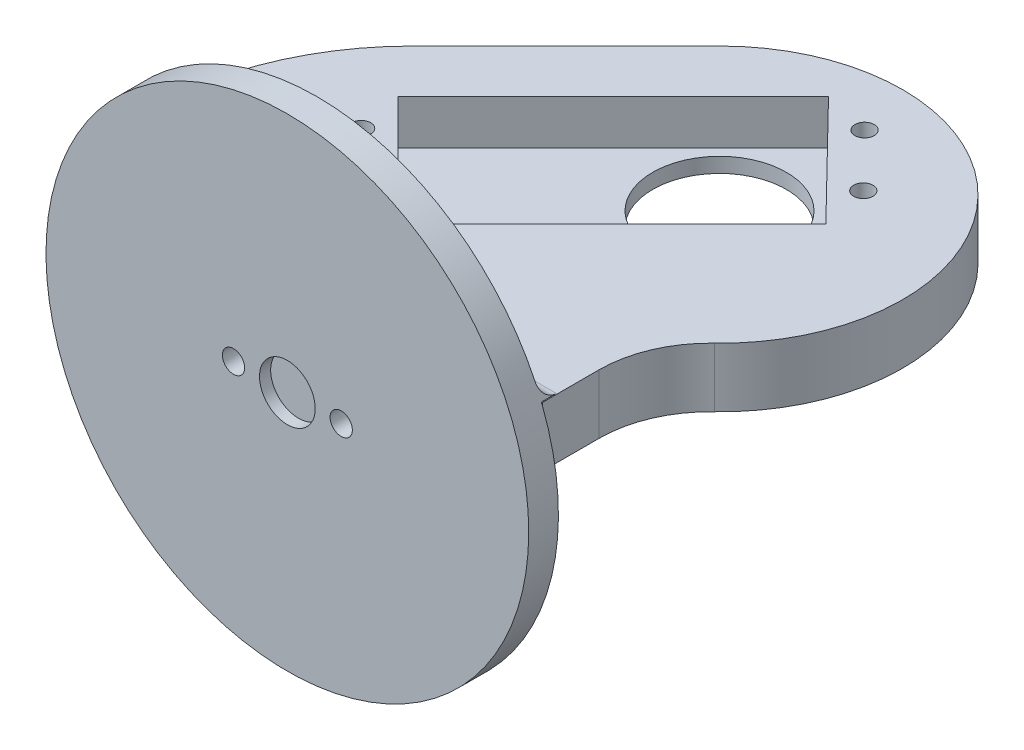
ISO-10303-21;
HEADER;
FILE_DESCRIPTION(('STEP AP214'),'2;1');
FILE_NAME('part.step','',(''),(''),'','','');
FILE_SCHEMA(('AUTOMOTIVE_DESIGN { 1 0 10303 214 1 1 1 1 }'));
ENDSEC;
DATA;
#1=APPLICATION_CONTEXT('core data for automotive mechanical design processes');
#2=APPLICATION_PROTOCOL_DEFINITION('international standard','automotive_design',2000,#1);
#3=PRODUCT_CONTEXT('',#1,'mechanical');
#4=PRODUCT('Part','Part','',(#3));
#5=PRODUCT_RELATED_PRODUCT_CATEGORY('part','',(#4));
#6=PRODUCT_DEFINITION_FORMATION('','',#4);
#7=PRODUCT_DEFINITION_CONTEXT('part definition',#1,'design');
#8=PRODUCT_DEFINITION('design','',#6,#7);
#9=PRODUCT_DEFINITION_SHAPE('','',#8);
#10=(LENGTH_UNIT() NAMED_UNIT(*) SI_UNIT(.MILLI.,.METRE.));
#11=(NAMED_UNIT(*) PLANE_ANGLE_UNIT() SI_UNIT($,.RADIAN.));
#12=(NAMED_UNIT(*) SI_UNIT($,.STERADIAN.) SOLID_ANGLE_UNIT());
#13=UNCERTAINTY_MEASURE_WITH_UNIT(LENGTH_MEASURE(1.E-05),#10,'distance_accuracy_value','');
#14=(GEOMETRIC_REPRESENTATION_CONTEXT(3) GLOBAL_UNCERTAINTY_ASSIGNED_CONTEXT((#13)) GLOBAL_UNIT_ASSIGNED_CONTEXT((#10,
#11,#12)) REPRESENTATION_CONTEXT('',''));
#15=CARTESIAN_POINT('',(0.,0.,0.));
#16=DIRECTION('',(0.,0.,1.));
#17=DIRECTION('',(1.,0.,0.));
#18=AXIS2_PLACEMENT_3D('',#15,#16,#17);
#19=CARTESIAN_POINT('',(4.9,12.,-7.88));
#20=DIRECTION('',(0.,-1.,0.));
#21=DIRECTION('',(0.,0.,-1.));
#22=AXIS2_PLACEMENT_3D('',#19,#20,#21);
#23=PLANE('',#22);
#24=DIRECTION('',(1.,0.,0.));
#25=VECTOR('',#24,1.);
#26=CARTESIAN_POINT('',(30.2034766210779,12.,-2.));
#27=LINE('',#26,#25);
#28=CARTESIAN_POINT('',(-30.2034766210779,12.,-2.));
#29=VERTEX_POINT('',#28);
#30=CARTESIAN_POINT('',(30.2034766210779,12.,-2.));
#31=VERTEX_POINT('',#30);
#32=EDGE_CURVE('E322',#29,#31,#27,.T.);
#33=ORIENTED_EDGE('',*,*,#32,.T.);
#34=DIRECTION('',(0.,0.,-1.));
#35=VECTOR('',#34,1.);
#36=CARTESIAN_POINT('',(30.2034766210779,12.,-2.));
#37=LINE('',#36,#35);
#38=CARTESIAN_POINT('',(30.2034766210779,12.,0.));
#39=VERTEX_POINT('',#38);
#40=EDGE_CURVE('E325',#31,#39,#37,.F.);
#41=ORIENTED_EDGE('',*,*,#40,.T.);
#42=DIRECTION('',(1.,0.,0.));
#43=VECTOR('',#42,1.);
#44=CARTESIAN_POINT('',(-30.33,12.,0.));
#45=LINE('',#44,#43);
#46=CARTESIAN_POINT('',(30.33,12.,0.));
#47=VERTEX_POINT('',#46);
#48=EDGE_CURVE('E215',#39,#47,#45,.T.);
#49=ORIENTED_EDGE('',*,*,#48,.T.);
#50=DIRECTION('',(0.,0.,-1.));
#51=VECTOR('',#50,1.);
#52=CARTESIAN_POINT('',(30.33,12.,-7.64000000000002));
#53=LINE('',#52,#51);
#54=CARTESIAN_POINT('',(30.33,12.,-7.64000000000002));
#55=VERTEX_POINT('',#54);
#56=EDGE_CURVE('E219',#47,#55,#53,.T.);
#57=ORIENTED_EDGE('',*,*,#56,.T.);
#58=CARTESIAN_POINT('',(45.33,12.,-7.64000000000002));
#59=DIRECTION('',(0.,-1.,0.));
#60=DIRECTION('',(0.,0.,1.));
#61=AXIS2_PLACEMENT_3D('',#58,#59,#60);
#62=CIRCLE('',#61,15.);
#63=CARTESIAN_POINT('',(34.987681306575,12.,-18.5044578347763));
#64=VERTEX_POINT('',#63);
#65=EDGE_CURVE('E221',#55,#64,#62,.T.);
#66=ORIENTED_EDGE('',*,*,#65,.T.);
#67=CARTESIAN_POINT('',(18.0952274406476,12.,-36.249738964911));
#68=DIRECTION('',(0.,1.,0.));
#69=DIRECTION('',(0.,0.,-1.));
#70=AXIS2_PLACEMENT_3D('',#67,#68,#69);
#71=CIRCLE('',#70,24.5);
#72=CARTESIAN_POINT('',(0.77111130157715,12.,-53.5738551039814));
#73=VERTEX_POINT('',#72);
#74=EDGE_CURVE('E223',#64,#73,#71,.T.);
#75=ORIENTED_EDGE('',*,*,#74,.T.);
#76=DIRECTION('',(-0.707106781186546,0.,0.707106781186549));
#77=VECTOR('',#76,1.);
#78=CARTESIAN_POINT('',(-20.0113719012021,12.,-32.791371901202));
#79=LINE('',#78,#77);
#80=CARTESIAN_POINT('',(-20.0113719012021,12.,-32.791371901202));
#81=VERTEX_POINT('',#80);
#82=EDGE_CURVE('E225',#73,#81,#79,.T.);
#83=ORIENTED_EDGE('',*,*,#82,.T.);
#84=CARTESIAN_POINT('',(4.9,12.,-7.88));
#85=DIRECTION('',(0.,1.,0.));
#86=DIRECTION('',(0.,0.,-1.));
#87=AXIS2_PLACEMENT_3D('',#84,#85,#86);
#88=CIRCLE('',#87,35.23);
#89=CARTESIAN_POINT('',(-30.33,12.,-7.87999999999999));
#90=VERTEX_POINT('',#89);
#91=EDGE_CURVE('E227',#81,#90,#88,.T.);
#92=ORIENTED_EDGE('',*,*,#91,.T.);
#93=DIRECTION('',(0.,0.,1.));
#94=VECTOR('',#93,1.);
#95=CARTESIAN_POINT('',(-30.33,12.,0.));
#96=LINE('',#95,#94);
#97=CARTESIAN_POINT('',(-30.33,12.,0.));
#98=VERTEX_POINT('',#97);
#99=EDGE_CURVE('E212',#90,#98,#96,.T.);
#100=ORIENTED_EDGE('',*,*,#99,.T.);
#101=CARTESIAN_POINT('',(-30.2034766210779,12.,0.));
#102=VERTEX_POINT('',#101);
#103=EDGE_CURVE('E217',#98,#102,#45,.T.);
#104=ORIENTED_EDGE('',*,*,#103,.T.);
#105=DIRECTION('',(0.,0.,-1.));
#106=VECTOR('',#105,1.);
#107=CARTESIAN_POINT('',(-30.2034766210779,12.,0.));
#108=LINE('',#107,#106);
#109=EDGE_CURVE('E65',#102,#29,#108,.T.);
#110=ORIENTED_EDGE('',*,*,#109,.T.);
#111=EDGE_LOOP('',(#33,#41,#49,#57,#66,#75,#83,#92,#100,#104,#110));
#112=FACE_BOUND('',#111,.T.);
#113=DIRECTION('',(0.707106781186549,0.,0.707106781186546));
#114=VECTOR('',#113,1.);
#115=CARTESIAN_POINT('',(3.95042191727117,12.,-6.93042191727117));
#116=LINE('',#115,#114);
#117=CARTESIAN_POINT('',(-15.0813780286484,12.,-25.9622218631907));
#118=VERTEX_POINT('',#117);
#119=CARTESIAN_POINT('',(-0.233212391306088,12.,-11.1140562258484));
#120=VERTEX_POINT('',#119);
#121=EDGE_CURVE('E172',#118,#120,#116,.T.);
#122=ORIENTED_EDGE('',*,*,#121,.F.);
#123=DIRECTION('',(-0.707106781186546,0.,0.707106781186549));
#124=VECTOR('',#123,1.);
#125=CARTESIAN_POINT('',(-14.1317999459196,12.,-26.9117999459195));
#126=LINE('',#125,#124);
#127=CARTESIAN_POINT('',(13.91,12.,-54.9535998918392));
#128=VERTEX_POINT('',#127);
#129=EDGE_CURVE('E293',#128,#118,#126,.T.);
#130=ORIENTED_EDGE('',*,*,#129,.F.);
#131=DIRECTION('',(-0.698540186739255,0.,-0.715570826340962));
#132=VECTOR('',#131,1.);
#133=CARTESIAN_POINT('',(33.0434681529289,12.,-35.3536514896287));
#134=LINE('',#133,#132);
#135=CARTESIAN_POINT('',(28.5793439215243,12.,-39.926612538679));
#136=VERTEX_POINT('',#135);
#137=EDGE_CURVE('E295',#136,#128,#134,.T.);
#138=ORIENTED_EDGE('',*,*,#137,.F.);
#139=DIRECTION('',(0.707106781186546,0.,-0.707106781186549));
#140=VECTOR('',#139,1.);
#141=CARTESIAN_POINT('',(0.716365691422737,12.,-12.0636343085772));
#142=LINE('',#141,#140);
#143=EDGE_CURVE('E298',#120,#136,#142,.T.);
#144=ORIENTED_EDGE('',*,*,#143,.F.);
#145=EDGE_LOOP('',(#122,#130,#138,#144));
#146=FACE_BOUND('',#145,.T.);
#147=CARTESIAN_POINT('',(27.2418707866518,12.,-46.3071427371416));
#148=DIRECTION('',(0.,-1.,0.));
#149=DIRECTION('',(0.,0.,-1.));
#150=AXIS2_PLACEMENT_3D('',#147,#148,#149);
#151=CIRCLE('',#150,1.29999999999999);
#152=CARTESIAN_POINT('',(27.2418707866518,12.,-47.6071427371416));
#153=VERTEX_POINT('',#152);
#154=EDGE_CURVE('E292',#153,#153,#151,.F.);
#155=ORIENTED_EDGE('',*,*,#154,.F.);
#156=EDGE_LOOP('',(#155));
#157=FACE_BOUND('',#156,.T.);
#158=CARTESIAN_POINT('',(20.2564689192593,12.,-53.4628510005513));
#159=DIRECTION('',(0.,-1.,0.));
#160=DIRECTION('',(0.,0.,-1.));
#161=AXIS2_PLACEMENT_3D('',#158,#159,#160);
#162=CIRCLE('',#161,1.3);
#163=CARTESIAN_POINT('',(20.2564689192593,12.,-54.7628510005513));
#164=VERTEX_POINT('',#163);
#165=EDGE_CURVE('E304',#164,#164,#162,.F.);
#166=ORIENTED_EDGE('',*,*,#165,.F.);
#167=EDGE_LOOP('',(#166));
#168=FACE_BOUND('',#167,.T.);
#169=CARTESIAN_POINT('',(-6.76962169938679,12.,-12.7028109070377));
#170=DIRECTION('',(0.,-1.,0.));
#171=DIRECTION('',(0.,0.,-1.));
#172=AXIS2_PLACEMENT_3D('',#169,#170,#171);
#173=CIRCLE('',#172,1.29999999999999);
#174=CARTESIAN_POINT('',(-6.76962169938679,12.,-14.0028109070377));
#175=VERTEX_POINT('',#174);
#176=EDGE_CURVE('E307',#175,#175,#173,.F.);
#177=ORIENTED_EDGE('',*,*,#176,.F.);
#178=EDGE_LOOP('',(#177));
#179=FACE_BOUND('',#178,.T.);
#180=CARTESIAN_POINT('',(-13.840686423658,12.,-19.7738818064961));
#181=DIRECTION('',(0.,-1.,0.));
#182=DIRECTION('',(0.,0.,-1.));
#183=AXIS2_PLACEMENT_3D('',#180,#181,#182);
#184=CIRCLE('',#183,1.3);
#185=CARTESIAN_POINT('',(-13.840686423658,12.,-21.0738818064961));
#186=VERTEX_POINT('',#185);
#187=EDGE_CURVE('E211',#186,#186,#184,.F.);
#188=ORIENTED_EDGE('',*,*,#187,.F.);
#189=EDGE_LOOP('',(#188));
#190=FACE_BOUND('',#189,.T.);
#191=ADVANCED_FACE('F45',(#112,#146,#157,#168,#179,#190),#23,.F.);
#192=CARTESIAN_POINT('',(13.91,12.,-40.28));
#193=DIRECTION('',(0.,-1.,0.));
#194=DIRECTION('',(0.,0.,-1.));
#195=AXIS2_PLACEMENT_3D('',#192,#193,#194);
#196=CYLINDRICAL_SURFACE('',#195,9.00000000000001);
#197=CARTESIAN_POINT('',(13.91,4.,-40.28));
#198=DIRECTION('',(0.,1.,0.));
#199=DIRECTION('',(0.,0.,1.));
#200=AXIS2_PLACEMENT_3D('',#197,#198,#199);
#201=CIRCLE('',#200,9.00000000000001);
#202=CARTESIAN_POINT('',(13.91,4.,-31.28));
#203=VERTEX_POINT('',#202);
#204=EDGE_CURVE('E207',#203,#203,#201,.T.);
#205=ORIENTED_EDGE('',*,*,#204,.F.);
#206=EDGE_LOOP('',(#205));
#207=FACE_BOUND('',#206,.T.);
#208=CARTESIAN_POINT('',(13.91,6.,-40.28));
#209=DIRECTION('',(0.,1.,0.));
#210=DIRECTION('',(0.,0.,1.));
#211=AXIS2_PLACEMENT_3D('',#208,#209,#210);
#212=CIRCLE('',#211,9.00000000000001);
#213=CARTESIAN_POINT('',(13.91,6.,-31.28));
#214=VERTEX_POINT('',#213);
#215=EDGE_CURVE('E175',#214,#214,#212,.T.);
#216=ORIENTED_EDGE('',*,*,#215,.T.);
#217=EDGE_LOOP('',(#216));
#218=FACE_BOUND('',#217,.T.);
#219=ADVANCED_FACE('F356',(#207,#218),#196,.F.);
#220=CARTESIAN_POINT('',(0.,0.,0.));
#221=DIRECTION('',(0.,0.,1.));
#222=DIRECTION('',(1.,0.,0.));
#223=AXIS2_PLACEMENT_3D('',#220,#221,#222);
#224=PLANE('',#223);
#225=CARTESIAN_POINT('',(0.,0.,0.));
#226=DIRECTION('',(0.,0.,1.));
#227=DIRECTION('',(1.,0.,0.));
#228=AXIS2_PLACEMENT_3D('',#225,#226,#227);
#229=CIRCLE('',#228,32.5);
#230=CARTESIAN_POINT('',(29.3300187521249,14.,0.));
#231=VERTEX_POINT('',#230);
#232=CARTESIAN_POINT('',(-29.3300187521249,14.,0.));
#233=VERTEX_POINT('',#232);
#234=EDGE_CURVE('E288',#231,#233,#229,.T.);
#235=ORIENTED_EDGE('',*,*,#234,.F.);
#236=DIRECTION('',(1.,0.,0.));
#237=VECTOR('',#236,1.);
#238=CARTESIAN_POINT('',(-30.2034766210779,14.,0.));
#239=LINE('',#238,#237);
#240=EDGE_CURVE('E72',#231,#233,#239,.F.);
#241=ORIENTED_EDGE('',*,*,#240,.T.);
#242=EDGE_LOOP('',(#235,#241));
#243=FACE_BOUND('',#242,.T.);
#244=ADVANCED_FACE('F338',(#243),#224,.F.);
#245=CARTESIAN_POINT('',(7.25,0.,0.));
#246=DIRECTION('',(0.,0.,1.));
#247=DIRECTION('',(1.,0.,0.));
#248=AXIS2_PLACEMENT_3D('',#245,#246,#247);
#249=CIRCLE('',#248,1.5);
#250=CARTESIAN_POINT('',(8.75,0.,0.));
#251=VERTEX_POINT('',#250);
#252=EDGE_CURVE('E267',#251,#251,#249,.T.);
#253=ORIENTED_EDGE('',*,*,#252,.T.);
#254=EDGE_LOOP('',(#253));
#255=FACE_BOUND('',#254,.T.);
#256=CARTESIAN_POINT('',(-7.25,0.,0.));
#257=DIRECTION('',(0.,0.,1.));
#258=DIRECTION('',(1.,0.,0.));
#259=AXIS2_PLACEMENT_3D('',#256,#257,#258);
#260=CIRCLE('',#259,1.5);
#261=CARTESIAN_POINT('',(-5.75,0.,0.));
#262=VERTEX_POINT('',#261);
#263=EDGE_CURVE('E273',#262,#262,#260,.T.);
#264=ORIENTED_EDGE('',*,*,#263,.T.);
#265=EDGE_LOOP('',(#264));
#266=FACE_BOUND('',#265,.T.);
#267=DIRECTION('',(1.,0.,0.));
#268=VECTOR('',#267,1.);
#269=CARTESIAN_POINT('',(0.,2.,0.));
#270=LINE('',#269,#268);
#271=CARTESIAN_POINT('',(-30.33,2.,0.));
#272=VERTEX_POINT('',#271);
#273=CARTESIAN_POINT('',(30.33,2.,0.));
#274=VERTEX_POINT('',#273);
#275=EDGE_CURVE('E301',#272,#274,#270,.T.);
#276=ORIENTED_EDGE('',*,*,#275,.T.);
#277=DIRECTION('',(0.,-1.,0.));
#278=VECTOR('',#277,1.);
#279=CARTESIAN_POINT('',(30.33,12.,0.));
#280=LINE('',#279,#278);
#281=CARTESIAN_POINT('',(30.33,11.6765191731098,0.));
#282=VERTEX_POINT('',#281);
#283=EDGE_CURVE('E259',#282,#274,#280,.T.);
#284=ORIENTED_EDGE('',*,*,#283,.F.);
#285=CARTESIAN_POINT('',(-30.33,11.6765191731098,0.));
#286=VERTEX_POINT('',#285);
#287=EDGE_CURVE('E279',#286,#282,#229,.T.);
#288=ORIENTED_EDGE('',*,*,#287,.F.);
#289=DIRECTION('',(0.,-1.,0.));
#290=VECTOR('',#289,1.);
#291=CARTESIAN_POINT('',(-30.33,12.,0.));
#292=LINE('',#291,#290);
#293=EDGE_CURVE('E263',#286,#272,#292,.T.);
#294=ORIENTED_EDGE('',*,*,#293,.T.);
#295=EDGE_LOOP('',(#276,#284,#288,#294));
#296=FACE_BOUND('',#295,.T.);
#297=ADVANCED_FACE('F415',(#255,#266,#296),#224,.F.);
#298=CARTESIAN_POINT('',(0.,0.,4.));
#299=DIRECTION('',(0.,0.,1.));
#300=DIRECTION('',(1.,0.,0.));
#301=AXIS2_PLACEMENT_3D('',#298,#299,#300);
#302=PLANE('',#301);
#303=CARTESIAN_POINT('',(0.,0.,4.));
#304=DIRECTION('',(0.,0.,1.));
#305=DIRECTION('',(1.,0.,0.));
#306=AXIS2_PLACEMENT_3D('',#303,#304,#305);
#307=CIRCLE('',#306,3.75);
#308=CARTESIAN_POINT('',(3.75,0.,4.));
#309=VERTEX_POINT('',#308);
#310=EDGE_CURVE('E262',#309,#309,#307,.T.);
#311=ORIENTED_EDGE('',*,*,#310,.F.);
#312=EDGE_LOOP('',(#311));
#313=FACE_BOUND('',#312,.T.);
#314=CARTESIAN_POINT('',(-7.25,0.,4.));
#315=DIRECTION('',(0.,0.,1.));
#316=DIRECTION('',(1.,0.,0.));
#317=AXIS2_PLACEMENT_3D('',#314,#315,#316);
#318=CIRCLE('',#317,1.5);
#319=CARTESIAN_POINT('',(-5.75,0.,4.));
#320=VERTEX_POINT('',#319);
#321=EDGE_CURVE('E276',#320,#320,#318,.T.);
#322=ORIENTED_EDGE('',*,*,#321,.F.);
#323=EDGE_LOOP('',(#322));
#324=FACE_BOUND('',#323,.T.);
#325=CARTESIAN_POINT('',(0.,0.,4.));
#326=DIRECTION('',(0.,0.,1.));
#327=DIRECTION('',(1.,0.,0.));
#328=AXIS2_PLACEMENT_3D('',#325,#326,#327);
#329=CIRCLE('',#328,32.5);
#330=CARTESIAN_POINT('',(32.5,0.,4.));
#331=VERTEX_POINT('',#330);
#332=EDGE_CURVE('E282',#331,#331,#329,.T.);
#333=ORIENTED_EDGE('',*,*,#332,.T.);
#334=EDGE_LOOP('',(#333));
#335=FACE_BOUND('',#334,.T.);
#336=CARTESIAN_POINT('',(7.25,0.,4.));
#337=DIRECTION('',(0.,0.,1.));
#338=DIRECTION('',(1.,0.,0.));
#339=AXIS2_PLACEMENT_3D('',#336,#337,#338);
#340=CIRCLE('',#339,1.5);
#341=CARTESIAN_POINT('',(8.75,0.,4.));
#342=VERTEX_POINT('',#341);
#343=EDGE_CURVE('E270',#342,#342,#340,.T.);
#344=ORIENTED_EDGE('',*,*,#343,.F.);
#345=EDGE_LOOP('',(#344));
#346=FACE_BOUND('',#345,.T.);
#347=ADVANCED_FACE('F336',(#313,#324,#335,#346),#302,.T.);
#348=CARTESIAN_POINT('',(0.,0.,4.));
#349=DIRECTION('',(0.,0.,-1.));
#350=DIRECTION('',(-1.,0.,0.));
#351=AXIS2_PLACEMENT_3D('',#348,#349,#350);
#352=CYLINDRICAL_SURFACE('',#351,32.5);
#353=ORIENTED_EDGE('',*,*,#332,.F.);
#354=EDGE_LOOP('',(#353));
#355=FACE_BOUND('',#354,.T.);
#356=EDGE_CURVE('E285',#282,#39,#229,.T.);
#357=ORIENTED_EDGE('',*,*,#356,.T.);
#358=ORIENTED_EDGE('',*,*,#40,.F.);
#359=CARTESIAN_POINT('',(30.2034766210779,12.,-2.));
#360=CARTESIAN_POINT('',(30.2034784151152,11.9999927600189,-1.94675951297227));
#361=CARTESIAN_POINT('',(30.2026320088612,12.002125782959,-1.89352257645469));
#362=CARTESIAN_POINT('',(30.1992569456938,12.0106168910282,-1.78744918222505));
#363=CARTESIAN_POINT('',(30.1967285740684,12.0169742596412,-1.73461265813359));
#364=CARTESIAN_POINT('',(30.1900120087473,12.033837822401,-1.6298444221725));
#365=CARTESIAN_POINT('',(30.1858279214418,12.0443337521494,-1.57791080115464));
#366=CARTESIAN_POINT('',(30.1758313470277,12.0693571797448,-1.47519858887599));
#367=CARTESIAN_POINT('',(30.1700188427727,12.0838847200425,-1.42442000978322));
#368=CARTESIAN_POINT('',(30.1501892605139,12.1333163177714,-1.27436043069524));
#369=CARTESIAN_POINT('',(30.1337732368277,12.1740867996755,-1.17724877133478));
#370=CARTESIAN_POINT('',(30.0949751223445,12.269682776155,-0.991569865551115));
#371=CARTESIAN_POINT('',(30.0725912080248,12.3245125664352,-0.903005242007101));
#372=CARTESIAN_POINT('',(30.0217390895433,12.4478807029655,-0.734250276161525));
#373=CARTESIAN_POINT('',(29.9931290110438,12.5167357900621,-0.654334415651119));
#374=CARTESIAN_POINT('',(29.9308655273522,12.6649019359006,-0.507209296912207));
#375=CARTESIAN_POINT('',(29.897211287844,12.7442147241097,-0.440002144901224));
#376=CARTESIAN_POINT('',(29.8231994671781,12.9165057114927,-0.315337933636711));
#377=CARTESIAN_POINT('',(29.7825443822375,13.0100426997429,-0.258831175123118));
#378=CARTESIAN_POINT('',(29.6972420577341,13.2035988843697,-0.16221316303832));
#379=CARTESIAN_POINT('',(29.6525918516946,13.3036228820914,-0.122114217881113));
#380=CARTESIAN_POINT('',(29.5624831901691,13.502624942514,-0.0601663594827103));
#381=CARTESIAN_POINT('',(29.5171638230349,13.6014270842125,-0.037541173161726));
#382=CARTESIAN_POINT('',(29.4247393752984,13.8002525420103,-0.0074603838095659));
#383=CARTESIAN_POINT('',(29.3776381355842,13.9002729479633,2.61431671424217E-05));
#384=CARTESIAN_POINT('',(29.3300187521249,14.,0.));
#385=B_SPLINE_CURVE_WITH_KNOTS('',3,(#359,#360,#361,#362,#363,#364,#365,#366,#367,#368,#369,
#370,#371,#372,#373,#374,#375,#376,#377,#378,#379,#380,#381,#382,#383,#384),.UNSPECIFIED.,.F.,
.F.,(4,2,2,2,2,2,2,2,2,2,2,2,4),(0.,0.159665902535489,0.319304730114466,0.478550089430211,
0.637797125573353,0.9559699582225,1.27424012201459,1.60070869904092,1.92723133445938,
2.27554999030513,2.62412946243602,2.95615455222107,3.28750072189868),.UNSPECIFIED.);
#386=EDGE_CURVE('E59',#31,#231,#385,.T.);
#387=ORIENTED_EDGE('',*,*,#386,.T.);
#388=ORIENTED_EDGE('',*,*,#234,.T.);
#389=CARTESIAN_POINT('',(-29.3300187521249,14.,0.));
#390=CARTESIAN_POINT('',(-29.3585127843781,13.9403072856482,-3.94205580735251E-06));
#391=CARTESIAN_POINT('',(-29.3868107696404,13.8805512343967,-0.00267407586751129));
#392=CARTESIAN_POINT('',(-29.4428661128356,13.7612489584218,-0.0133965946033428));
#393=CARTESIAN_POINT('',(-29.470623312928,13.7017027989938,-0.0214505273917345));
#394=CARTESIAN_POINT('',(-29.5529518317855,13.5236861501729,-0.0538059831770795));
#395=CARTESIAN_POINT('',(-29.6064585961442,13.4060921733357,-0.0863016094657985));
#396=CARTESIAN_POINT('',(-29.7091731449341,13.1769067431476,-0.173095756918437));
#397=CARTESIAN_POINT('',(-29.7583711880369,13.0653290998761,-0.227442204671689));
#398=CARTESIAN_POINT('',(-29.8508795701186,12.8525647990873,-0.357175782251159));
#399=CARTESIAN_POINT('',(-29.8941985236348,12.7513629924202,-0.432531621446992));
#400=CARTESIAN_POINT('',(-29.9710137453351,12.5697033443921,-0.597050330595786));
#401=CARTESIAN_POINT('',(-30.0049701216203,12.4883163222945,-0.684970740242887));
#402=CARTESIAN_POINT('',(-30.0656039808007,12.3416278381036,-0.875614171077128));
#403=CARTESIAN_POINT('',(-30.0922816275899,12.2763260138257,-0.978336858884035));
#404=CARTESIAN_POINT('',(-30.1355661056349,12.1696630287675,-1.18615003511276));
#405=CARTESIAN_POINT('',(-30.1528332870721,12.1267454981785,-1.29030750583991));
#406=CARTESIAN_POINT('',(-30.1800195569284,12.0589293449631,-1.50514952683956));
#407=CARTESIAN_POINT('',(-30.1899516996646,12.0339987125234,-1.61582210104475));
#408=CARTESIAN_POINT('',(-30.1985451963263,12.0124060371271,-1.77294182122634));
#409=CARTESIAN_POINT('',(-30.2003949426747,12.0077540738477,-1.81824526827485));
#410=CARTESIAN_POINT('',(-30.2028591374311,12.0015544671458,-1.90902464205252));
#411=CARTESIAN_POINT('',(-30.2034755578111,12.0000018681406,-1.95450017677777));
#412=CARTESIAN_POINT('',(-30.2034766210779,12.,-2.));
#413=B_SPLINE_CURVE_WITH_KNOTS('',3,(#389,#390,#391,#392,#393,#394,#395,#396,#397,#398,#399,
#400,#401,#402,#403,#404,#405,#406,#407,#408,#409,#410,#411,#412),.UNSPECIFIED.,.F.,.F.,(4,2,2,
2,2,2,2,2,2,2,2,4),(0.,0.198322851251565,0.396702745672847,0.794298761713398,1.19277164586244,
1.59065420036457,1.96222717577041,2.33379178383382,2.67396911207534,3.01353955114313,
3.15017876547262,3.28659933141261),.UNSPECIFIED.);
#414=EDGE_CURVE('E11',#233,#29,#413,.T.);
#415=ORIENTED_EDGE('',*,*,#414,.T.);
#416=ORIENTED_EDGE('',*,*,#109,.F.);
#417=EDGE_CURVE('E289',#102,#286,#229,.T.);
#418=ORIENTED_EDGE('',*,*,#417,.T.);
#419=ORIENTED_EDGE('',*,*,#287,.T.);
#420=EDGE_LOOP('',(#357,#358,#387,#388,#415,#416,#418,#419));
#421=FACE_BOUND('',#420,.T.);
#422=ADVANCED_FACE('F331',(#355,#421),#352,.T.);
#423=CARTESIAN_POINT('',(-7.25,0.,4.));
#424=DIRECTION('',(0.,0.,-1.));
#425=DIRECTION('',(-1.,0.,0.));
#426=AXIS2_PLACEMENT_3D('',#423,#424,#425);
#427=CYLINDRICAL_SURFACE('',#426,1.5);
#428=ORIENTED_EDGE('',*,*,#321,.T.);
#429=EDGE_LOOP('',(#428));
#430=FACE_BOUND('',#429,.T.);
#431=ORIENTED_EDGE('',*,*,#263,.F.);
#432=EDGE_LOOP('',(#431));
#433=FACE_BOUND('',#432,.T.);
#434=ADVANCED_FACE('F335',(#430,#433),#427,.F.);
#435=CARTESIAN_POINT('',(7.25,0.,4.));
#436=DIRECTION('',(0.,0.,-1.));
#437=DIRECTION('',(-1.,0.,0.));
#438=AXIS2_PLACEMENT_3D('',#435,#436,#437);
#439=CYLINDRICAL_SURFACE('',#438,1.5);
#440=ORIENTED_EDGE('',*,*,#343,.T.);
#441=EDGE_LOOP('',(#440));
#442=FACE_BOUND('',#441,.T.);
#443=ORIENTED_EDGE('',*,*,#252,.F.);
#444=EDGE_LOOP('',(#443));
#445=FACE_BOUND('',#444,.T.);
#446=ADVANCED_FACE('F407',(#442,#445),#439,.F.);
#447=CARTESIAN_POINT('',(0.,0.,2.5));
#448=DIRECTION('',(0.,0.,1.));
#449=DIRECTION('',(1.,0.,0.));
#450=AXIS2_PLACEMENT_3D('',#447,#448,#449);
#451=CYLINDRICAL_SURFACE('',#450,3.75);
#452=CARTESIAN_POINT('',(0.,0.,2.5));
#453=DIRECTION('',(0.,0.,1.));
#454=DIRECTION('',(1.,0.,0.));
#455=AXIS2_PLACEMENT_3D('',#452,#453,#454);
#456=CIRCLE('',#455,3.75);
#457=CARTESIAN_POINT('',(3.75,0.,2.5));
#458=VERTEX_POINT('',#457);
#459=EDGE_CURVE('E264',#458,#458,#456,.T.);
#460=ORIENTED_EDGE('',*,*,#459,.F.);
#461=EDGE_LOOP('',(#460));
#462=FACE_BOUND('',#461,.T.);
#463=ORIENTED_EDGE('',*,*,#310,.T.);
#464=EDGE_LOOP('',(#463));
#465=FACE_BOUND('',#464,.T.);
#466=ADVANCED_FACE('F403',(#462,#465),#451,.F.);
#467=CARTESIAN_POINT('',(0.,0.,2.5));
#468=DIRECTION('',(0.,0.,1.));
#469=DIRECTION('',(1.,0.,0.));
#470=AXIS2_PLACEMENT_3D('',#467,#468,#469);
#471=PLANE('',#470);
#472=ORIENTED_EDGE('',*,*,#459,.T.);
#473=EDGE_LOOP('',(#472));
#474=FACE_BOUND('',#473,.T.);
#475=ADVANCED_FACE('F400',(#474),#471,.T.);
#476=CARTESIAN_POINT('',(-30.33,12.,0.));
#477=DIRECTION('',(0.,0.,-1.));
#478=DIRECTION('',(-1.,0.,0.));
#479=AXIS2_PLACEMENT_3D('',#476,#477,#478);
#480=PLANE('',#479);
#481=ORIENTED_EDGE('',*,*,#356,.F.);
#482=EDGE_CURVE('E255',#47,#282,#280,.T.);
#483=ORIENTED_EDGE('',*,*,#482,.F.);
#484=ORIENTED_EDGE('',*,*,#48,.F.);
#485=EDGE_LOOP('',(#481,#483,#484));
#486=FACE_BOUND('',#485,.T.);
#487=ADVANCED_FACE('F372',(#486),#480,.F.);
#488=CARTESIAN_POINT('',(4.9,4.,-7.88));
#489=DIRECTION('',(0.,-1.,0.));
#490=DIRECTION('',(0.,0.,-1.));
#491=AXIS2_PLACEMENT_3D('',#488,#489,#490);
#492=PLANE('',#491);
#493=DIRECTION('',(0.,0.,-1.));
#494=VECTOR('',#493,1.);
#495=CARTESIAN_POINT('',(30.33,4.,-7.64000000000002));
#496=LINE('',#495,#494);
#497=CARTESIAN_POINT('',(30.33,4.,-2.));
#498=VERTEX_POINT('',#497);
#499=CARTESIAN_POINT('',(30.33,4.,-7.64000000000002));
#500=VERTEX_POINT('',#499);
#501=EDGE_CURVE('E232',#498,#500,#496,.T.);
#502=ORIENTED_EDGE('',*,*,#501,.F.);
#503=DIRECTION('',(1.,0.,0.));
#504=VECTOR('',#503,1.);
#505=CARTESIAN_POINT('',(4.9,4.,-2.));
#506=LINE('',#505,#504);
#507=CARTESIAN_POINT('',(-30.33,4.,-2.));
#508=VERTEX_POINT('',#507);
#509=EDGE_CURVE('E314',#498,#508,#506,.F.);
#510=ORIENTED_EDGE('',*,*,#509,.T.);
#511=DIRECTION('',(0.,0.,1.));
#512=VECTOR('',#511,1.);
#513=CARTESIAN_POINT('',(-30.33,4.,0.));
#514=LINE('',#513,#512);
#515=CARTESIAN_POINT('',(-30.33,4.,-7.87999999999999));
#516=VERTEX_POINT('',#515);
#517=EDGE_CURVE('E210',#516,#508,#514,.T.);
#518=ORIENTED_EDGE('',*,*,#517,.F.);
#519=CARTESIAN_POINT('',(4.9,4.,-7.88));
#520=DIRECTION('',(0.,1.,0.));
#521=DIRECTION('',(0.,0.,-1.));
#522=AXIS2_PLACEMENT_3D('',#519,#520,#521);
#523=CIRCLE('',#522,35.23);
#524=CARTESIAN_POINT('',(-20.0113719012021,4.,-32.791371901202));
#525=VERTEX_POINT('',#524);
#526=EDGE_CURVE('E216',#525,#516,#523,.T.);
#527=ORIENTED_EDGE('',*,*,#526,.F.);
#528=DIRECTION('',(-0.707106781186546,0.,0.707106781186549));
#529=VECTOR('',#528,1.);
#530=CARTESIAN_POINT('',(-20.0113719012021,4.,-32.791371901202));
#531=LINE('',#530,#529);
#532=CARTESIAN_POINT('',(0.77111130157715,4.,-53.5738551039814));
#533=VERTEX_POINT('',#532);
#534=EDGE_CURVE('E238',#533,#525,#531,.T.);
#535=ORIENTED_EDGE('',*,*,#534,.F.);
#536=CARTESIAN_POINT('',(18.0952274406476,4.,-36.249738964911));
#537=DIRECTION('',(0.,1.,0.));
#538=DIRECTION('',(0.,0.,-1.));
#539=AXIS2_PLACEMENT_3D('',#536,#537,#538);
#540=CIRCLE('',#539,24.5);
#541=CARTESIAN_POINT('',(34.987681306575,4.,-18.5044578347763));
#542=VERTEX_POINT('',#541);
#543=EDGE_CURVE('E236',#542,#533,#540,.T.);
#544=ORIENTED_EDGE('',*,*,#543,.F.);
#545=CARTESIAN_POINT('',(45.33,4.,-7.64000000000002));
#546=DIRECTION('',(0.,-1.,0.));
#547=DIRECTION('',(0.,0.,1.));
#548=AXIS2_PLACEMENT_3D('',#545,#546,#547);
#549=CIRCLE('',#548,15.);
#550=EDGE_CURVE('E234',#500,#542,#549,.T.);
#551=ORIENTED_EDGE('',*,*,#550,.F.);
#552=EDGE_LOOP('',(#502,#510,#518,#527,#535,#544,#551));
#553=FACE_BOUND('',#552,.T.);
#554=ORIENTED_EDGE('',*,*,#204,.T.);
#555=EDGE_LOOP('',(#554));
#556=FACE_BOUND('',#555,.T.);
#557=ADVANCED_FACE('F368',(#553,#556),#492,.T.);
#558=CARTESIAN_POINT('',(-30.33,12.,0.));
#559=DIRECTION('',(1.,0.,0.));
#560=DIRECTION('',(0.,0.,-1.));
#561=AXIS2_PLACEMENT_3D('',#558,#559,#560);
#562=PLANE('',#561);
#563=ORIENTED_EDGE('',*,*,#517,.T.);
#564=CARTESIAN_POINT('',(-30.33,2.,-2.));
#565=DIRECTION('',(1.,0.,0.));
#566=DIRECTION('',(0.,0.,-1.));
#567=AXIS2_PLACEMENT_3D('',#564,#565,#566);
#568=CIRCLE('',#567,2.);
#569=EDGE_CURVE('E318',#508,#272,#568,.T.);
#570=ORIENTED_EDGE('',*,*,#569,.T.);
#571=ORIENTED_EDGE('',*,*,#293,.F.);
#572=EDGE_CURVE('E258',#98,#286,#292,.T.);
#573=ORIENTED_EDGE('',*,*,#572,.F.);
#574=ORIENTED_EDGE('',*,*,#99,.F.);
#575=DIRECTION('',(0.,-1.,0.));
#576=VECTOR('',#575,1.);
#577=CARTESIAN_POINT('',(-30.33,12.,-7.87999999999999));
#578=LINE('',#577,#576);
#579=EDGE_CURVE('E229',#90,#516,#578,.T.);
#580=ORIENTED_EDGE('',*,*,#579,.T.);
#581=EDGE_LOOP('',(#563,#570,#571,#573,#574,#580));
#582=FACE_BOUND('',#581,.T.);
#583=ADVANCED_FACE('F371',(#582),#562,.F.);
#584=ORIENTED_EDGE('',*,*,#417,.F.);
#585=ORIENTED_EDGE('',*,*,#103,.F.);
#586=ORIENTED_EDGE('',*,*,#572,.T.);
#587=EDGE_LOOP('',(#584,#585,#586));
#588=FACE_BOUND('',#587,.T.);
#589=ADVANCED_FACE('F392',(#588),#480,.F.);
#590=CARTESIAN_POINT('',(30.33,12.,-7.64000000000002));
#591=DIRECTION('',(-1.,0.,0.));
#592=DIRECTION('',(0.,0.,1.));
#593=AXIS2_PLACEMENT_3D('',#590,#591,#592);
#594=PLANE('',#593);
#595=ORIENTED_EDGE('',*,*,#283,.T.);
#596=CARTESIAN_POINT('',(30.33,2.,-2.));
#597=DIRECTION('',(-1.,0.,0.));
#598=DIRECTION('',(0.,0.,1.));
#599=AXIS2_PLACEMENT_3D('',#596,#597,#598);
#600=CIRCLE('',#599,2.);
#601=EDGE_CURVE('E316',#274,#498,#600,.T.);
#602=ORIENTED_EDGE('',*,*,#601,.T.);
#603=ORIENTED_EDGE('',*,*,#501,.T.);
#604=DIRECTION('',(0.,-1.,0.));
#605=VECTOR('',#604,1.);
#606=CARTESIAN_POINT('',(30.33,12.,-7.64000000000002));
#607=LINE('',#606,#605);
#608=EDGE_CURVE('E252',#55,#500,#607,.T.);
#609=ORIENTED_EDGE('',*,*,#608,.F.);
#610=ORIENTED_EDGE('',*,*,#56,.F.);
#611=ORIENTED_EDGE('',*,*,#482,.T.);
#612=EDGE_LOOP('',(#595,#602,#603,#609,#610,#611));
#613=FACE_BOUND('',#612,.T.);
#614=ADVANCED_FACE('F389',(#613),#594,.F.);
#615=CARTESIAN_POINT('',(45.33,12.,-7.64000000000002));
#616=DIRECTION('',(0.,-1.,0.));
#617=DIRECTION('',(0.,0.,-1.));
#618=AXIS2_PLACEMENT_3D('',#615,#616,#617);
#619=CYLINDRICAL_SURFACE('',#618,15.);
#620=ORIENTED_EDGE('',*,*,#550,.T.);
#621=DIRECTION('',(0.,-1.,0.));
#622=VECTOR('',#621,1.);
#623=CARTESIAN_POINT('',(34.987681306575,12.,-18.5044578347763));
#624=LINE('',#623,#622);
#625=EDGE_CURVE('E249',#64,#542,#624,.T.);
#626=ORIENTED_EDGE('',*,*,#625,.F.);
#627=ORIENTED_EDGE('',*,*,#65,.F.);
#628=ORIENTED_EDGE('',*,*,#608,.T.);
#629=EDGE_LOOP('',(#620,#626,#627,#628));
#630=FACE_BOUND('',#629,.T.);
#631=ADVANCED_FACE('F385',(#630),#619,.F.);
#632=CARTESIAN_POINT('',(18.0952274406476,12.,-36.249738964911));
#633=DIRECTION('',(0.,-1.,0.));
#634=DIRECTION('',(0.,0.,-1.));
#635=AXIS2_PLACEMENT_3D('',#632,#633,#634);
#636=CYLINDRICAL_SURFACE('',#635,24.5);
#637=ORIENTED_EDGE('',*,*,#543,.T.);
#638=DIRECTION('',(0.,-1.,0.));
#639=VECTOR('',#638,1.);
#640=CARTESIAN_POINT('',(0.77111130157715,12.,-53.5738551039814));
#641=LINE('',#640,#639);
#642=EDGE_CURVE('E246',#73,#533,#641,.T.);
#643=ORIENTED_EDGE('',*,*,#642,.F.);
#644=ORIENTED_EDGE('',*,*,#74,.F.);
#645=ORIENTED_EDGE('',*,*,#625,.T.);
#646=EDGE_LOOP('',(#637,#643,#644,#645));
#647=FACE_BOUND('',#646,.T.);
#648=ADVANCED_FACE('F381',(#647),#636,.T.);
#649=CARTESIAN_POINT('',(-20.0113719012021,12.,-32.791371901202));
#650=DIRECTION('',(0.707106781186549,0.,0.707106781186546));
#651=DIRECTION('',(0.707106781186546,0.,-0.707106781186549));
#652=AXIS2_PLACEMENT_3D('',#649,#650,#651);
#653=PLANE('',#652);
#654=ORIENTED_EDGE('',*,*,#534,.T.);
#655=DIRECTION('',(0.,-1.,0.));
#656=VECTOR('',#655,1.);
#657=CARTESIAN_POINT('',(-20.0113719012021,12.,-32.791371901202));
#658=LINE('',#657,#656);
#659=EDGE_CURVE('E243',#81,#525,#658,.T.);
#660=ORIENTED_EDGE('',*,*,#659,.F.);
#661=ORIENTED_EDGE('',*,*,#82,.F.);
#662=ORIENTED_EDGE('',*,*,#642,.T.);
#663=EDGE_LOOP('',(#654,#660,#661,#662));
#664=FACE_BOUND('',#663,.T.);
#665=ADVANCED_FACE('F377',(#664),#653,.F.);
#666=CARTESIAN_POINT('',(4.9,12.,-7.88));
#667=DIRECTION('',(0.,-1.,0.));
#668=DIRECTION('',(0.,0.,-1.));
#669=AXIS2_PLACEMENT_3D('',#666,#667,#668);
#670=CYLINDRICAL_SURFACE('',#669,35.23);
#671=ORIENTED_EDGE('',*,*,#526,.T.);
#672=ORIENTED_EDGE('',*,*,#579,.F.);
#673=ORIENTED_EDGE('',*,*,#91,.F.);
#674=ORIENTED_EDGE('',*,*,#659,.T.);
#675=EDGE_LOOP('',(#671,#672,#673,#674));
#676=FACE_BOUND('',#675,.T.);
#677=ADVANCED_FACE('F374',(#676),#670,.T.);
#678=CARTESIAN_POINT('',(-15.0813780286484,73.,-25.9622218631907));
#679=DIRECTION('',(0.707106781186546,0.,-0.707106781186549));
#680=DIRECTION('',(-0.707106781186549,0.,-0.707106781186546));
#681=AXIS2_PLACEMENT_3D('',#678,#679,#680);
#682=PLANE('',#681);
#683=ORIENTED_EDGE('',*,*,#121,.T.);
#684=DIRECTION('',(0.,-1.,0.));
#685=VECTOR('',#684,1.);
#686=CARTESIAN_POINT('',(-0.233212391306088,73.,-11.1140562258484));
#687=LINE('',#686,#685);
#688=CARTESIAN_POINT('',(-0.233212391306088,6.,-11.1140562258484));
#689=VERTEX_POINT('',#688);
#690=EDGE_CURVE('E165',#120,#689,#687,.T.);
#691=ORIENTED_EDGE('',*,*,#690,.T.);
#692=DIRECTION('',(0.707106781186549,0.,0.707106781186546));
#693=VECTOR('',#692,1.);
#694=CARTESIAN_POINT('',(-15.0813780286484,6.,-25.9622218631907));
#695=LINE('',#694,#693);
#696=CARTESIAN_POINT('',(-15.0813780286484,6.,-25.9622218631907));
#697=VERTEX_POINT('',#696);
#698=EDGE_CURVE('E170',#697,#689,#695,.T.);
#699=ORIENTED_EDGE('',*,*,#698,.F.);
#700=DIRECTION('',(0.,-1.,0.));
#701=VECTOR('',#700,1.);
#702=CARTESIAN_POINT('',(-15.0813780286484,73.,-25.9622218631907));
#703=LINE('',#702,#701);
#704=EDGE_CURVE('E202',#118,#697,#703,.T.);
#705=ORIENTED_EDGE('',*,*,#704,.F.);
#706=EDGE_LOOP('',(#683,#691,#699,#705));
#707=FACE_BOUND('',#706,.T.);
#708=ADVANCED_FACE('F167',(#707),#682,.T.);
#709=CARTESIAN_POINT('',(-0.233212391306088,73.,-11.1140562258484));
#710=DIRECTION('',(-0.707106781186549,0.,-0.707106781186546));
#711=DIRECTION('',(-0.707106781186546,0.,0.707106781186549));
#712=AXIS2_PLACEMENT_3D('',#709,#710,#711);
#713=PLANE('',#712);
#714=ORIENTED_EDGE('',*,*,#143,.T.);
#715=DIRECTION('',(0.,-1.,0.));
#716=VECTOR('',#715,1.);
#717=CARTESIAN_POINT('',(28.5793439215243,73.,-39.926612538679));
#718=LINE('',#717,#716);
#719=CARTESIAN_POINT('',(28.5793439215243,6.,-39.926612538679));
#720=VERTEX_POINT('',#719);
#721=EDGE_CURVE('E176',#136,#720,#718,.T.);
#722=ORIENTED_EDGE('',*,*,#721,.T.);
#723=DIRECTION('',(0.707106781186546,0.,-0.707106781186549));
#724=VECTOR('',#723,1.);
#725=CARTESIAN_POINT('',(-0.233212391306088,6.,-11.1140562258484));
#726=LINE('',#725,#724);
#727=EDGE_CURVE('E179',#689,#720,#726,.T.);
#728=ORIENTED_EDGE('',*,*,#727,.F.);
#729=ORIENTED_EDGE('',*,*,#690,.F.);
#730=EDGE_LOOP('',(#714,#722,#728,#729));
#731=FACE_BOUND('',#730,.T.);
#732=ADVANCED_FACE('F180',(#731),#713,.T.);
#733=CARTESIAN_POINT('',(13.91,73.,-54.9535998918392));
#734=DIRECTION('',(-0.715570826340962,0.,0.698540186739255));
#735=DIRECTION('',(0.698540186739255,0.,0.715570826340962));
#736=AXIS2_PLACEMENT_3D('',#733,#734,#735);
#737=PLANE('',#736);
#738=ORIENTED_EDGE('',*,*,#137,.T.);
#739=DIRECTION('',(0.,-1.,0.));
#740=VECTOR('',#739,1.);
#741=CARTESIAN_POINT('',(13.91,73.,-54.9535998918392));
#742=LINE('',#741,#740);
#743=CARTESIAN_POINT('',(13.91,6.,-54.9535998918392));
#744=VERTEX_POINT('',#743);
#745=EDGE_CURVE('E204',#128,#744,#742,.T.);
#746=ORIENTED_EDGE('',*,*,#745,.T.);
#747=DIRECTION('',(-0.698540186739255,0.,-0.715570826340962));
#748=VECTOR('',#747,1.);
#749=CARTESIAN_POINT('',(13.91,6.,-54.9535998918392));
#750=LINE('',#749,#748);
#751=EDGE_CURVE('E185',#720,#744,#750,.T.);
#752=ORIENTED_EDGE('',*,*,#751,.F.);
#753=ORIENTED_EDGE('',*,*,#721,.F.);
#754=EDGE_LOOP('',(#738,#746,#752,#753));
#755=FACE_BOUND('',#754,.T.);
#756=ADVANCED_FACE('F587',(#755),#737,.T.);
#757=CARTESIAN_POINT('',(-15.0813780286484,73.,-25.9622218631907));
#758=DIRECTION('',(0.707106781186549,0.,0.707106781186546));
#759=DIRECTION('',(0.707106781186546,0.,-0.707106781186549));
#760=AXIS2_PLACEMENT_3D('',#757,#758,#759);
#761=PLANE('',#760);
#762=ORIENTED_EDGE('',*,*,#129,.T.);
#763=ORIENTED_EDGE('',*,*,#704,.T.);
#764=DIRECTION('',(-0.707106781186546,0.,0.707106781186549));
#765=VECTOR('',#764,1.);
#766=CARTESIAN_POINT('',(-15.0813780286484,6.,-25.9622218631907));
#767=LINE('',#766,#765);
#768=EDGE_CURVE('E190',#744,#697,#767,.T.);
#769=ORIENTED_EDGE('',*,*,#768,.F.);
#770=ORIENTED_EDGE('',*,*,#745,.F.);
#771=EDGE_LOOP('',(#762,#763,#769,#770));
#772=FACE_BOUND('',#771,.T.);
#773=ADVANCED_FACE('F577',(#772),#761,.T.);
#774=CARTESIAN_POINT('',(0.,6.,0.));
#775=DIRECTION('',(0.,1.,0.));
#776=DIRECTION('',(0.,0.,1.));
#777=AXIS2_PLACEMENT_3D('',#774,#775,#776);
#778=PLANE('',#777);
#779=ORIENTED_EDGE('',*,*,#215,.F.);
#780=EDGE_LOOP('',(#779));
#781=FACE_BOUND('',#780,.T.);
#782=ORIENTED_EDGE('',*,*,#698,.T.);
#783=ORIENTED_EDGE('',*,*,#727,.T.);
#784=ORIENTED_EDGE('',*,*,#751,.T.);
#785=ORIENTED_EDGE('',*,*,#768,.T.);
#786=EDGE_LOOP('',(#782,#783,#784,#785));
#787=FACE_BOUND('',#786,.T.);
#788=ADVANCED_FACE('F188',(#781,#787),#778,.T.);
#789=CARTESIAN_POINT('',(27.2418707866518,73.,-46.3071427371416));
#790=DIRECTION('',(0.,-1.,0.));
#791=DIRECTION('',(0.,0.,-1.));
#792=AXIS2_PLACEMENT_3D('',#789,#790,#791);
#793=CYLINDRICAL_SURFACE('',#792,1.29999999999999);
#794=CARTESIAN_POINT('',(27.2418707866518,6.,-46.3071427371416));
#795=DIRECTION('',(0.,1.,0.));
#796=DIRECTION('',(0.,0.,1.));
#797=AXIS2_PLACEMENT_3D('',#794,#795,#796);
#798=CIRCLE('',#797,1.29999999999999);
#799=CARTESIAN_POINT('',(27.2418707866518,6.,-45.0071427371417));
#800=VERTEX_POINT('',#799);
#801=EDGE_CURVE('E191',#800,#800,#798,.T.);
#802=ORIENTED_EDGE('',*,*,#801,.F.);
#803=EDGE_LOOP('',(#802));
#804=FACE_BOUND('',#803,.T.);
#805=ORIENTED_EDGE('',*,*,#154,.T.);
#806=EDGE_LOOP('',(#805));
#807=FACE_BOUND('',#806,.T.);
#808=ADVANCED_FACE('F556',(#804,#807),#793,.F.);
#809=CARTESIAN_POINT('',(27.2418707866518,6.,-46.3071427371416));
#810=DIRECTION('',(0.,1.,0.));
#811=DIRECTION('',(0.,0.,1.));
#812=AXIS2_PLACEMENT_3D('',#809,#810,#811);
#813=PLANE('',#812);
#814=ORIENTED_EDGE('',*,*,#801,.T.);
#815=EDGE_LOOP('',(#814));
#816=FACE_BOUND('',#815,.T.);
#817=ADVANCED_FACE('F545',(#816),#813,.T.);
#818=CARTESIAN_POINT('',(20.2564689192593,73.,-53.4628510005513));
#819=DIRECTION('',(0.,-1.,0.));
#820=DIRECTION('',(0.,0.,-1.));
#821=AXIS2_PLACEMENT_3D('',#818,#819,#820);
#822=CYLINDRICAL_SURFACE('',#821,1.3);
#823=CARTESIAN_POINT('',(20.2564689192593,6.,-53.4628510005513));
#824=DIRECTION('',(0.,1.,0.));
#825=DIRECTION('',(0.,0.,1.));
#826=AXIS2_PLACEMENT_3D('',#823,#824,#825);
#827=CIRCLE('',#826,1.3);
#828=CARTESIAN_POINT('',(20.2564689192593,6.,-52.1628510005513));
#829=VERTEX_POINT('',#828);
#830=EDGE_CURVE('E194',#829,#829,#827,.T.);
#831=ORIENTED_EDGE('',*,*,#830,.F.);
#832=EDGE_LOOP('',(#831));
#833=FACE_BOUND('',#832,.T.);
#834=ORIENTED_EDGE('',*,*,#165,.T.);
#835=EDGE_LOOP('',(#834));
#836=FACE_BOUND('',#835,.T.);
#837=ADVANCED_FACE('F534',(#833,#836),#822,.F.);
#838=CARTESIAN_POINT('',(20.2564689192593,6.,-53.4628510005513));
#839=DIRECTION('',(0.,1.,0.));
#840=DIRECTION('',(0.,0.,1.));
#841=AXIS2_PLACEMENT_3D('',#838,#839,#840);
#842=PLANE('',#841);
#843=ORIENTED_EDGE('',*,*,#830,.T.);
#844=EDGE_LOOP('',(#843));
#845=FACE_BOUND('',#844,.T.);
#846=ADVANCED_FACE('F523',(#845),#842,.T.);
#847=CARTESIAN_POINT('',(-6.76962169938679,73.,-12.7028109070377));
#848=DIRECTION('',(0.,-1.,0.));
#849=DIRECTION('',(0.,0.,-1.));
#850=AXIS2_PLACEMENT_3D('',#847,#848,#849);
#851=CYLINDRICAL_SURFACE('',#850,1.29999999999999);
#852=CARTESIAN_POINT('',(-6.76962169938679,6.,-12.7028109070377));
#853=DIRECTION('',(0.,1.,0.));
#854=DIRECTION('',(0.,0.,-1.));
#855=AXIS2_PLACEMENT_3D('',#852,#853,#854);
#856=CIRCLE('',#855,1.29999999999999);
#857=CARTESIAN_POINT('',(-6.76962169938679,6.,-14.0028109070377));
#858=VERTEX_POINT('',#857);
#859=EDGE_CURVE('E760',#858,#858,#856,.T.);
#860=ORIENTED_EDGE('',*,*,#859,.F.);
#861=EDGE_LOOP('',(#860));
#862=FACE_BOUND('',#861,.T.);
#863=ORIENTED_EDGE('',*,*,#176,.T.);
#864=EDGE_LOOP('',(#863));
#865=FACE_BOUND('',#864,.T.);
#866=ADVANCED_FACE('F512',(#862,#865),#851,.F.);
#867=CARTESIAN_POINT('',(-6.76962169938679,6.,-12.7028109070377));
#868=DIRECTION('',(0.,-1.,0.));
#869=DIRECTION('',(0.,0.,-1.));
#870=AXIS2_PLACEMENT_3D('',#867,#868,#869);
#871=PLANE('',#870);
#872=ORIENTED_EDGE('',*,*,#859,.T.);
#873=EDGE_LOOP('',(#872));
#874=FACE_BOUND('',#873,.T.);
#875=ADVANCED_FACE('F501',(#874),#871,.F.);
#876=CARTESIAN_POINT('',(-13.840686423658,73.,-19.7738818064961));
#877=DIRECTION('',(0.,-1.,0.));
#878=DIRECTION('',(0.,0.,-1.));
#879=AXIS2_PLACEMENT_3D('',#876,#877,#878);
#880=CYLINDRICAL_SURFACE('',#879,1.3);
#881=CARTESIAN_POINT('',(-13.840686423658,6.,-19.7738818064961));
#882=DIRECTION('',(0.,1.,0.));
#883=DIRECTION('',(0.,0.,-1.));
#884=AXIS2_PLACEMENT_3D('',#881,#882,#883);
#885=CIRCLE('',#884,1.3);
#886=CARTESIAN_POINT('',(-13.840686423658,6.,-21.0738818064961));
#887=VERTEX_POINT('',#886);
#888=EDGE_CURVE('E197',#887,#887,#885,.T.);
#889=ORIENTED_EDGE('',*,*,#888,.F.);
#890=EDGE_LOOP('',(#889));
#891=FACE_BOUND('',#890,.T.);
#892=ORIENTED_EDGE('',*,*,#187,.T.);
#893=EDGE_LOOP('',(#892));
#894=FACE_BOUND('',#893,.T.);
#895=ADVANCED_FACE('F352',(#891,#894),#880,.F.);
#896=CARTESIAN_POINT('',(-13.840686423658,6.,-19.7738818064961));
#897=DIRECTION('',(0.,-1.,0.));
#898=DIRECTION('',(0.,0.,-1.));
#899=AXIS2_PLACEMENT_3D('',#896,#897,#898);
#900=PLANE('',#899);
#901=ORIENTED_EDGE('',*,*,#888,.T.);
#902=EDGE_LOOP('',(#901));
#903=FACE_BOUND('',#902,.T.);
#904=ADVANCED_FACE('F343',(#903),#900,.F.);
#905=CARTESIAN_POINT('',(0.,2.,-2.));
#906=DIRECTION('',(1.,0.,0.));
#907=DIRECTION('',(0.,0.,-1.));
#908=AXIS2_PLACEMENT_3D('',#905,#906,#907);
#909=CYLINDRICAL_SURFACE('',#908,2.);
#910=ORIENTED_EDGE('',*,*,#569,.F.);
#911=ORIENTED_EDGE('',*,*,#509,.F.);
#912=ORIENTED_EDGE('',*,*,#601,.F.);
#913=ORIENTED_EDGE('',*,*,#275,.F.);
#914=EDGE_LOOP('',(#910,#911,#912,#913));
#915=FACE_BOUND('',#914,.T.);
#916=ADVANCED_FACE('F340',(#915),#909,.F.);
#917=CARTESIAN_POINT('',(4.9,14.,-2.));
#918=DIRECTION('',(-1.,0.,0.));
#919=DIRECTION('',(0.,0.,1.));
#920=AXIS2_PLACEMENT_3D('',#917,#918,#919);
#921=CYLINDRICAL_SURFACE('',#920,2.);
#922=ORIENTED_EDGE('',*,*,#414,.F.);
#923=ORIENTED_EDGE('',*,*,#240,.F.);
#924=ORIENTED_EDGE('',*,*,#386,.F.);
#925=ORIENTED_EDGE('',*,*,#32,.F.);
#926=EDGE_LOOP('',(#922,#923,#924,#925));
#927=FACE_BOUND('',#926,.T.);
#928=ADVANCED_FACE('F47',(#927),#921,.F.);
#929=CLOSED_SHELL('',(#191,#219,#244,#297,#347,#422,#434,#446,#466,#475,#487,#557,#583,#589,
#614,#631,#648,#665,#677,#708,#732,#756,#773,#788,#808,#817,#837,#846,#866,#875,#895,#904,#916,#928));
#930=MANIFOLD_SOLID_BREP('B2',#929);
#931=ADVANCED_BREP_SHAPE_REPRESENTATION('',(#18,#930),#14);
#932=SHAPE_DEFINITION_REPRESENTATION(#9,#931);
ENDSEC;
END-ISO-10303-21;
